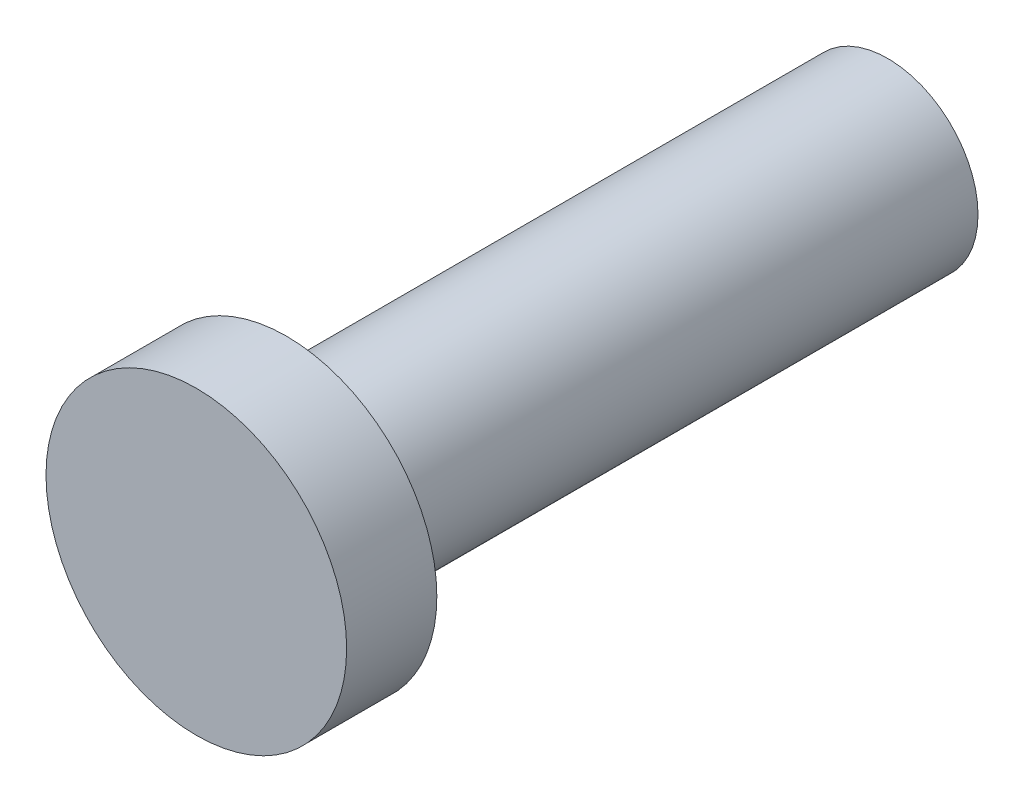
ISO-10303-21;
HEADER;
FILE_DESCRIPTION(('STEP AP214'),'2;1');
FILE_NAME('part.step','',(''),(''),'','','');
FILE_SCHEMA(('AUTOMOTIVE_DESIGN { 1 0 10303 214 1 1 1 1 }'));
ENDSEC;
DATA;
#1=APPLICATION_CONTEXT('core data for automotive mechanical design processes');
#2=APPLICATION_PROTOCOL_DEFINITION('international standard','automotive_design',2000,#1);
#3=PRODUCT_CONTEXT('',#1,'mechanical');
#4=PRODUCT('Part','Part','',(#3));
#5=PRODUCT_RELATED_PRODUCT_CATEGORY('part','',(#4));
#6=PRODUCT_DEFINITION_FORMATION('','',#4);
#7=PRODUCT_DEFINITION_CONTEXT('part definition',#1,'design');
#8=PRODUCT_DEFINITION('design','',#6,#7);
#9=PRODUCT_DEFINITION_SHAPE('','',#8);
#10=(LENGTH_UNIT() NAMED_UNIT(*) SI_UNIT(.MILLI.,.METRE.));
#11=(NAMED_UNIT(*) PLANE_ANGLE_UNIT() SI_UNIT($,.RADIAN.));
#12=(NAMED_UNIT(*) SI_UNIT($,.STERADIAN.) SOLID_ANGLE_UNIT());
#13=UNCERTAINTY_MEASURE_WITH_UNIT(LENGTH_MEASURE(1.E-05),#10,'distance_accuracy_value','');
#14=(GEOMETRIC_REPRESENTATION_CONTEXT(3) GLOBAL_UNCERTAINTY_ASSIGNED_CONTEXT((#13)) GLOBAL_UNIT_ASSIGNED_CONTEXT((#10,
#11,#12)) REPRESENTATION_CONTEXT('',''));
#15=CARTESIAN_POINT('',(0.,0.,0.));
#16=DIRECTION('',(0.,0.,1.));
#17=DIRECTION('',(1.,0.,0.));
#18=AXIS2_PLACEMENT_3D('',#15,#16,#17);
#19=CARTESIAN_POINT('',(0.,0.,1.5));
#20=DIRECTION('',(0.,0.,-1.));
#21=DIRECTION('',(-1.,0.,0.));
#22=AXIS2_PLACEMENT_3D('',#19,#20,#21);
#23=CYLINDRICAL_SURFACE('',#22,2.5);
#24=CARTESIAN_POINT('',(0.,0.,1.5));
#25=DIRECTION('',(0.,0.,1.));
#26=DIRECTION('',(1.,0.,0.));
#27=AXIS2_PLACEMENT_3D('',#24,#25,#26);
#28=CIRCLE('',#27,2.5);
#29=CARTESIAN_POINT('',(2.5,0.,1.5));
#30=VERTEX_POINT('',#29);
#31=EDGE_CURVE('E10',#30,#30,#28,.T.);
#32=ORIENTED_EDGE('',*,*,#31,.F.);
#33=EDGE_LOOP('',(#32));
#34=FACE_BOUND('',#33,.T.);
#35=CARTESIAN_POINT('',(0.,0.,0.));
#36=DIRECTION('',(0.,0.,1.));
#37=DIRECTION('',(1.,0.,0.));
#38=AXIS2_PLACEMENT_3D('',#35,#36,#37);
#39=CIRCLE('',#38,2.5);
#40=CARTESIAN_POINT('',(2.5,0.,0.));
#41=VERTEX_POINT('',#40);
#42=EDGE_CURVE('E42',#41,#41,#39,.T.);
#43=ORIENTED_EDGE('',*,*,#42,.T.);
#44=EDGE_LOOP('',(#43));
#45=FACE_BOUND('',#44,.T.);
#46=ADVANCED_FACE('F39',(#34,#45),#23,.T.);
#47=CARTESIAN_POINT('',(0.,0.,1.5));
#48=DIRECTION('',(0.,0.,1.));
#49=DIRECTION('',(1.,0.,0.));
#50=AXIS2_PLACEMENT_3D('',#47,#48,#49);
#51=PLANE('',#50);
#52=ORIENTED_EDGE('',*,*,#31,.T.);
#53=EDGE_LOOP('',(#52));
#54=FACE_BOUND('',#53,.T.);
#55=ADVANCED_FACE('F69',(#54),#51,.T.);
#56=CARTESIAN_POINT('',(0.,0.,0.));
#57=DIRECTION('',(0.,0.,1.));
#58=DIRECTION('',(1.,0.,0.));
#59=AXIS2_PLACEMENT_3D('',#56,#57,#58);
#60=PLANE('',#59);
#61=CARTESIAN_POINT('',(0.,0.,0.));
#62=DIRECTION('',(0.,0.,1.));
#63=DIRECTION('',(1.,0.,0.));
#64=AXIS2_PLACEMENT_3D('',#61,#62,#63);
#65=CIRCLE('',#64,1.5);
#66=CARTESIAN_POINT('',(1.5,0.,0.));
#67=VERTEX_POINT('',#66);
#68=EDGE_CURVE('E51',#67,#67,#65,.T.);
#69=ORIENTED_EDGE('',*,*,#68,.T.);
#70=EDGE_LOOP('',(#69));
#71=FACE_BOUND('',#70,.T.);
#72=ORIENTED_EDGE('',*,*,#42,.F.);
#73=EDGE_LOOP('',(#72));
#74=FACE_BOUND('',#73,.T.);
#75=ADVANCED_FACE('F66',(#71,#74),#60,.F.);
#76=CARTESIAN_POINT('',(0.,0.,-10.));
#77=DIRECTION('',(0.,0.,1.));
#78=DIRECTION('',(1.,0.,0.));
#79=AXIS2_PLACEMENT_3D('',#76,#77,#78);
#80=CYLINDRICAL_SURFACE('',#79,1.5);
#81=CARTESIAN_POINT('',(0.,0.,-10.));
#82=DIRECTION('',(0.,0.,1.));
#83=DIRECTION('',(1.,0.,0.));
#84=AXIS2_PLACEMENT_3D('',#81,#82,#83);
#85=CIRCLE('',#84,1.5);
#86=CARTESIAN_POINT('',(1.5,0.,-10.));
#87=VERTEX_POINT('',#86);
#88=EDGE_CURVE('E49',#87,#87,#85,.T.);
#89=ORIENTED_EDGE('',*,*,#88,.T.);
#90=EDGE_LOOP('',(#89));
#91=FACE_BOUND('',#90,.T.);
#92=ORIENTED_EDGE('',*,*,#68,.F.);
#93=EDGE_LOOP('',(#92));
#94=FACE_BOUND('',#93,.T.);
#95=ADVANCED_FACE('F57',(#91,#94),#80,.T.);
#96=CARTESIAN_POINT('',(0.,0.,-10.));
#97=DIRECTION('',(0.,0.,1.));
#98=DIRECTION('',(1.,0.,0.));
#99=AXIS2_PLACEMENT_3D('',#96,#97,#98);
#100=PLANE('',#99);
#101=ORIENTED_EDGE('',*,*,#88,.F.);
#102=EDGE_LOOP('',(#101));
#103=FACE_BOUND('',#102,.T.);
#104=ADVANCED_FACE('F60',(#103),#100,.F.);
#105=CLOSED_SHELL('',(#46,#55,#75,#95,#104));
#106=MANIFOLD_SOLID_BREP('B2',#105);
#107=ADVANCED_BREP_SHAPE_REPRESENTATION('',(#18,#106),#14);
#108=SHAPE_DEFINITION_REPRESENTATION(#9,#107);
ENDSEC;
END-ISO-10303-21;
